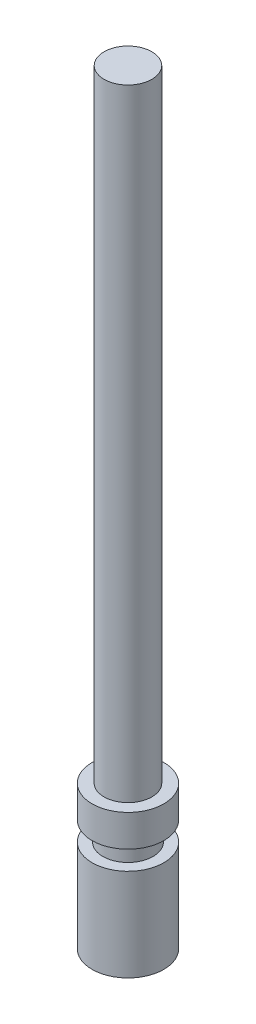
ISO-10303-21;
HEADER;
FILE_DESCRIPTION(('STEP AP214'),'2;1');
FILE_NAME('part.step','',(''),(''),'','','');
FILE_SCHEMA(('AUTOMOTIVE_DESIGN { 1 0 10303 214 1 1 1 1 }'));
ENDSEC;
DATA;
#1=APPLICATION_CONTEXT('core data for automotive mechanical design processes');
#2=APPLICATION_PROTOCOL_DEFINITION('international standard','automotive_design',2000,#1);
#3=PRODUCT_CONTEXT('',#1,'mechanical');
#4=PRODUCT('Part','Part','',(#3));
#5=PRODUCT_RELATED_PRODUCT_CATEGORY('part','',(#4));
#6=PRODUCT_DEFINITION_FORMATION('','',#4);
#7=PRODUCT_DEFINITION_CONTEXT('part definition',#1,'design');
#8=PRODUCT_DEFINITION('design','',#6,#7);
#9=PRODUCT_DEFINITION_SHAPE('','',#8);
#10=(LENGTH_UNIT() NAMED_UNIT(*) SI_UNIT(.MILLI.,.METRE.));
#11=(NAMED_UNIT(*) PLANE_ANGLE_UNIT() SI_UNIT($,.RADIAN.));
#12=(NAMED_UNIT(*) SI_UNIT($,.STERADIAN.) SOLID_ANGLE_UNIT());
#13=UNCERTAINTY_MEASURE_WITH_UNIT(LENGTH_MEASURE(1.E-05),#10,'distance_accuracy_value','');
#14=(GEOMETRIC_REPRESENTATION_CONTEXT(3) GLOBAL_UNCERTAINTY_ASSIGNED_CONTEXT((#13)) GLOBAL_UNIT_ASSIGNED_CONTEXT((#10,
#11,#12)) REPRESENTATION_CONTEXT('',''));
#15=CARTESIAN_POINT('',(0.,0.,0.));
#16=DIRECTION('',(0.,0.,1.));
#17=DIRECTION('',(1.,0.,0.));
#18=AXIS2_PLACEMENT_3D('',#15,#16,#17);
#19=CARTESIAN_POINT('',(0.,18.,0.));
#20=DIRECTION('',(0.,-1.,0.));
#21=DIRECTION('',(0.,0.,-1.));
#22=AXIS2_PLACEMENT_3D('',#19,#20,#21);
#23=CYLINDRICAL_SURFACE('',#22,4.5);
#24=CARTESIAN_POINT('',(0.,14.,0.));
#25=DIRECTION('',(0.,1.,0.));
#26=DIRECTION('',(0.,0.,1.));
#27=AXIS2_PLACEMENT_3D('',#24,#25,#26);
#28=CIRCLE('',#27,4.5);
#29=CARTESIAN_POINT('',(0.,14.,4.5));
#30=VERTEX_POINT('',#29);
#31=EDGE_CURVE('E47',#30,#30,#28,.T.);
#32=ORIENTED_EDGE('',*,*,#31,.T.);
#33=EDGE_LOOP('',(#32));
#34=FACE_BOUND('',#33,.T.);
#35=CARTESIAN_POINT('',(0.,18.,0.));
#36=DIRECTION('',(0.,1.,0.));
#37=DIRECTION('',(0.,0.,1.));
#38=AXIS2_PLACEMENT_3D('',#35,#36,#37);
#39=CIRCLE('',#38,4.5);
#40=CARTESIAN_POINT('',(0.,18.,4.5));
#41=VERTEX_POINT('',#40);
#42=EDGE_CURVE('E11',#41,#41,#39,.T.);
#43=ORIENTED_EDGE('',*,*,#42,.F.);
#44=EDGE_LOOP('',(#43));
#45=FACE_BOUND('',#44,.T.);
#46=ADVANCED_FACE('F44',(#34,#45),#23,.T.);
#47=CARTESIAN_POINT('',(0.,18.,0.));
#48=DIRECTION('',(0.,1.,0.));
#49=DIRECTION('',(0.,0.,1.));
#50=AXIS2_PLACEMENT_3D('',#47,#48,#49);
#51=PLANE('',#50);
#52=CARTESIAN_POINT('',(0.,18.,0.));
#53=DIRECTION('',(0.,1.,0.));
#54=DIRECTION('',(0.,0.,1.));
#55=AXIS2_PLACEMENT_3D('',#52,#53,#54);
#56=CIRCLE('',#55,3.);
#57=CARTESIAN_POINT('',(0.,18.,3.));
#58=VERTEX_POINT('',#57);
#59=EDGE_CURVE('E58',#58,#58,#56,.F.);
#60=ORIENTED_EDGE('',*,*,#59,.T.);
#61=EDGE_LOOP('',(#60));
#62=FACE_BOUND('',#61,.T.);
#63=ORIENTED_EDGE('',*,*,#42,.T.);
#64=EDGE_LOOP('',(#63));
#65=FACE_BOUND('',#64,.T.);
#66=ADVANCED_FACE('F88',(#62,#65),#51,.T.);
#67=CARTESIAN_POINT('',(0.,96.,0.));
#68=DIRECTION('',(0.,-1.,0.));
#69=DIRECTION('',(0.,0.,-1.));
#70=AXIS2_PLACEMENT_3D('',#67,#68,#69);
#71=CYLINDRICAL_SURFACE('',#70,3.);
#72=ORIENTED_EDGE('',*,*,#59,.F.);
#73=EDGE_LOOP('',(#72));
#74=FACE_BOUND('',#73,.T.);
#75=CARTESIAN_POINT('',(0.,96.,0.));
#76=DIRECTION('',(0.,1.,0.));
#77=DIRECTION('',(0.,0.,1.));
#78=AXIS2_PLACEMENT_3D('',#75,#76,#77);
#79=CIRCLE('',#78,3.);
#80=CARTESIAN_POINT('',(0.,96.,3.));
#81=VERTEX_POINT('',#80);
#82=EDGE_CURVE('E71',#81,#81,#79,.T.);
#83=ORIENTED_EDGE('',*,*,#82,.F.);
#84=EDGE_LOOP('',(#83));
#85=FACE_BOUND('',#84,.T.);
#86=ADVANCED_FACE('F90',(#74,#85),#71,.T.);
#87=CARTESIAN_POINT('',(0.,96.,0.));
#88=DIRECTION('',(0.,1.,0.));
#89=DIRECTION('',(0.,0.,1.));
#90=AXIS2_PLACEMENT_3D('',#87,#88,#89);
#91=PLANE('',#90);
#92=ORIENTED_EDGE('',*,*,#82,.T.);
#93=EDGE_LOOP('',(#92));
#94=FACE_BOUND('',#93,.T.);
#95=ADVANCED_FACE('F93',(#94),#91,.T.);
#96=CARTESIAN_POINT('',(0.,14.,0.));
#97=DIRECTION('',(0.,1.,0.));
#98=DIRECTION('',(0.,0.,1.));
#99=AXIS2_PLACEMENT_3D('',#96,#97,#98);
#100=PLANE('',#99);
#101=CARTESIAN_POINT('',(0.,14.,0.));
#102=DIRECTION('',(0.,1.,0.));
#103=DIRECTION('',(0.,0.,1.));
#104=AXIS2_PLACEMENT_3D('',#101,#102,#103);
#105=CIRCLE('',#104,3.15);
#106=CARTESIAN_POINT('',(0.,14.,3.15));
#107=VERTEX_POINT('',#106);
#108=EDGE_CURVE('E65',#107,#107,#105,.T.);
#109=ORIENTED_EDGE('',*,*,#108,.T.);
#110=EDGE_LOOP('',(#109));
#111=FACE_BOUND('',#110,.T.);
#112=ORIENTED_EDGE('',*,*,#31,.F.);
#113=EDGE_LOOP('',(#112));
#114=FACE_BOUND('',#113,.T.);
#115=ADVANCED_FACE('F99',(#111,#114),#100,.F.);
#116=CARTESIAN_POINT('',(0.,11.6,0.));
#117=DIRECTION('',(0.,1.,0.));
#118=DIRECTION('',(0.,0.,1.));
#119=AXIS2_PLACEMENT_3D('',#116,#117,#118);
#120=PLANE('',#119);
#121=CARTESIAN_POINT('',(0.,11.6,0.));
#122=DIRECTION('',(0.,1.,0.));
#123=DIRECTION('',(0.,0.,1.));
#124=AXIS2_PLACEMENT_3D('',#121,#122,#123);
#125=CIRCLE('',#124,3.15);
#126=CARTESIAN_POINT('',(0.,11.6,3.15));
#127=VERTEX_POINT('',#126);
#128=EDGE_CURVE('E73',#127,#127,#125,.T.);
#129=ORIENTED_EDGE('',*,*,#128,.F.);
#130=EDGE_LOOP('',(#129));
#131=FACE_BOUND('',#130,.T.);
#132=CARTESIAN_POINT('',(0.,11.6,0.));
#133=DIRECTION('',(0.,1.,0.));
#134=DIRECTION('',(0.,0.,1.));
#135=AXIS2_PLACEMENT_3D('',#132,#133,#134);
#136=CIRCLE('',#135,4.5);
#137=CARTESIAN_POINT('',(0.,11.6,4.5));
#138=VERTEX_POINT('',#137);
#139=EDGE_CURVE('E62',#138,#138,#136,.T.);
#140=ORIENTED_EDGE('',*,*,#139,.T.);
#141=EDGE_LOOP('',(#140));
#142=FACE_BOUND('',#141,.T.);
#143=ADVANCED_FACE('F122',(#131,#142),#120,.T.);
#144=CARTESIAN_POINT('',(0.,14.,0.));
#145=DIRECTION('',(0.,-1.,0.));
#146=DIRECTION('',(0.,0.,-1.));
#147=AXIS2_PLACEMENT_3D('',#144,#145,#146);
#148=CYLINDRICAL_SURFACE('',#147,3.15);
#149=ORIENTED_EDGE('',*,*,#108,.F.);
#150=EDGE_LOOP('',(#149));
#151=FACE_BOUND('',#150,.T.);
#152=ORIENTED_EDGE('',*,*,#128,.T.);
#153=EDGE_LOOP('',(#152));
#154=FACE_BOUND('',#153,.T.);
#155=ADVANCED_FACE('F116',(#151,#154),#148,.T.);
#156=CARTESIAN_POINT('',(0.,0.,0.));
#157=DIRECTION('',(0.,1.,0.));
#158=DIRECTION('',(0.,0.,1.));
#159=AXIS2_PLACEMENT_3D('',#156,#157,#158);
#160=PLANE('',#159);
#161=CARTESIAN_POINT('',(0.,0.,0.));
#162=DIRECTION('',(0.,1.,0.));
#163=DIRECTION('',(0.,0.,1.));
#164=AXIS2_PLACEMENT_3D('',#161,#162,#163);
#165=CIRCLE('',#164,4.5);
#166=CARTESIAN_POINT('',(0.,0.,4.5));
#167=VERTEX_POINT('',#166);
#168=EDGE_CURVE('E52',#167,#167,#165,.T.);
#169=ORIENTED_EDGE('',*,*,#168,.F.);
#170=EDGE_LOOP('',(#169));
#171=FACE_BOUND('',#170,.T.);
#172=ADVANCED_FACE('F111',(#171),#160,.F.);
#173=ORIENTED_EDGE('',*,*,#168,.T.);
#174=EDGE_LOOP('',(#173));
#175=FACE_BOUND('',#174,.T.);
#176=ORIENTED_EDGE('',*,*,#139,.F.);
#177=EDGE_LOOP('',(#176));
#178=FACE_BOUND('',#177,.T.);
#179=ADVANCED_FACE('F105',(#175,#178),#23,.T.);
#180=CLOSED_SHELL('',(#46,#66,#86,#95,#115,#143,#155,#172,#179));
#181=MANIFOLD_SOLID_BREP('B2',#180);
#182=ADVANCED_BREP_SHAPE_REPRESENTATION('',(#18,#181),#14);
#183=SHAPE_DEFINITION_REPRESENTATION(#9,#182);
ENDSEC;
END-ISO-10303-21;
